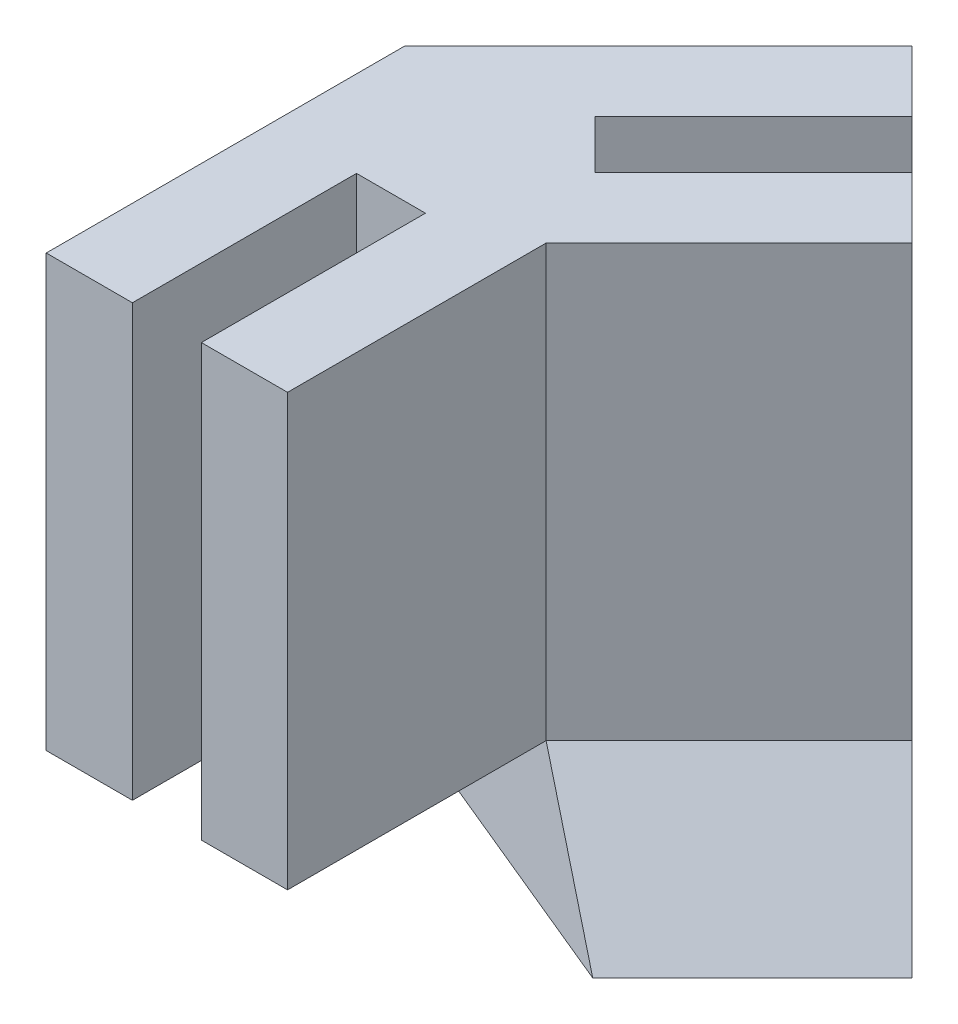
ISO-10303-21;
HEADER;
FILE_DESCRIPTION(('STEP AP214'),'2;1');
FILE_NAME('part.step','',(''),(''),'','','');
FILE_SCHEMA(('AUTOMOTIVE_DESIGN { 1 0 10303 214 1 1 1 1 }'));
ENDSEC;
DATA;
#1=APPLICATION_CONTEXT('core data for automotive mechanical design processes');
#2=APPLICATION_PROTOCOL_DEFINITION('international standard','automotive_design',2000,#1);
#3=PRODUCT_CONTEXT('',#1,'mechanical');
#4=PRODUCT('Part','Part','',(#3));
#5=PRODUCT_RELATED_PRODUCT_CATEGORY('part','',(#4));
#6=PRODUCT_DEFINITION_FORMATION('','',#4);
#7=PRODUCT_DEFINITION_CONTEXT('part definition',#1,'design');
#8=PRODUCT_DEFINITION('design','',#6,#7);
#9=PRODUCT_DEFINITION_SHAPE('','',#8);
#10=(LENGTH_UNIT() NAMED_UNIT(*) SI_UNIT(.MILLI.,.METRE.));
#11=(NAMED_UNIT(*) PLANE_ANGLE_UNIT() SI_UNIT($,.RADIAN.));
#12=(NAMED_UNIT(*) SI_UNIT($,.STERADIAN.) SOLID_ANGLE_UNIT());
#13=UNCERTAINTY_MEASURE_WITH_UNIT(LENGTH_MEASURE(1.E-05),#10,'distance_accuracy_value','');
#14=(GEOMETRIC_REPRESENTATION_CONTEXT(3) GLOBAL_UNCERTAINTY_ASSIGNED_CONTEXT((#13)) GLOBAL_UNIT_ASSIGNED_CONTEXT((#10,
#11,#12)) REPRESENTATION_CONTEXT('',''));
#15=CARTESIAN_POINT('',(0.,0.,0.));
#16=DIRECTION('',(0.,0.,1.));
#17=DIRECTION('',(1.,0.,0.));
#18=AXIS2_PLACEMENT_3D('',#15,#16,#17);
#19=CARTESIAN_POINT('',(0.,0.,0.));
#20=DIRECTION('',(0.,-1.,0.));
#21=DIRECTION('',(0.,0.,-1.));
#22=AXIS2_PLACEMENT_3D('',#19,#20,#21);
#23=PLANE('',#22);
#24=DIRECTION('',(0.,0.,1.));
#25=VECTOR('',#24,1.);
#26=CARTESIAN_POINT('',(-14.,0.,15.));
#27=LINE('',#26,#25);
#28=CARTESIAN_POINT('',(-14.,0.,-5.79898987322323));
#29=VERTEX_POINT('',#28);
#30=CARTESIAN_POINT('',(-14.,0.,15.));
#31=VERTEX_POINT('',#30);
#32=EDGE_CURVE('E136',#29,#31,#27,.T.);
#33=ORIENTED_EDGE('',*,*,#32,.F.);
#34=DIRECTION('',(0.923879532511289,0.,0.382683432365084));
#35=VECTOR('',#34,1.);
#36=CARTESIAN_POINT('',(-14.,0.,-5.79898987322323));
#37=LINE('',#36,#35);
#38=CARTESIAN_POINT('',(0.,0.,0.));
#39=VERTEX_POINT('',#38);
#40=EDGE_CURVE('E298',#29,#39,#37,.T.);
#41=ORIENTED_EDGE('',*,*,#40,.T.);
#42=DIRECTION('',(0.,0.,-1.));
#43=VECTOR('',#42,1.);
#44=CARTESIAN_POINT('',(0.,0.,0.));
#45=LINE('',#44,#43);
#46=CARTESIAN_POINT('',(0.,0.,15.));
#47=VERTEX_POINT('',#46);
#48=EDGE_CURVE('E153',#47,#39,#45,.T.);
#49=ORIENTED_EDGE('',*,*,#48,.F.);
#50=DIRECTION('',(1.,0.,0.));
#51=VECTOR('',#50,1.);
#52=CARTESIAN_POINT('',(0.,0.,15.));
#53=LINE('',#52,#51);
#54=CARTESIAN_POINT('',(-5.,0.,15.));
#55=VERTEX_POINT('',#54);
#56=EDGE_CURVE('E88',#55,#47,#53,.T.);
#57=ORIENTED_EDGE('',*,*,#56,.F.);
#58=DIRECTION('',(0.,0.,1.));
#59=VECTOR('',#58,1.);
#60=CARTESIAN_POINT('',(-5.,0.,15.));
#61=LINE('',#60,#59);
#62=CARTESIAN_POINT('',(-5.00000000000004,0.,1.99999999999999));
#63=VERTEX_POINT('',#62);
#64=EDGE_CURVE('E81',#63,#55,#61,.T.);
#65=ORIENTED_EDGE('',*,*,#64,.F.);
#66=DIRECTION('',(1.,0.,0.));
#67=VECTOR('',#66,1.);
#68=CARTESIAN_POINT('',(-5.00000000000004,0.,1.99999999999999));
#69=LINE('',#68,#67);
#70=CARTESIAN_POINT('',(-9.00000000000004,0.,1.99999999999999));
#71=VERTEX_POINT('',#70);
#72=EDGE_CURVE('E146',#71,#63,#69,.T.);
#73=ORIENTED_EDGE('',*,*,#72,.F.);
#74=DIRECTION('',(0.,0.,-1.));
#75=VECTOR('',#74,1.);
#76=CARTESIAN_POINT('',(-9.00000000000004,0.,1.99999999999999));
#77=LINE('',#76,#75);
#78=CARTESIAN_POINT('',(-9.,0.,15.));
#79=VERTEX_POINT('',#78);
#80=EDGE_CURVE('E143',#79,#71,#77,.T.);
#81=ORIENTED_EDGE('',*,*,#80,.F.);
#82=DIRECTION('',(1.,0.,0.));
#83=VECTOR('',#82,1.);
#84=CARTESIAN_POINT('',(-9.,0.,15.));
#85=LINE('',#84,#83);
#86=EDGE_CURVE('E139',#31,#79,#85,.T.);
#87=ORIENTED_EDGE('',*,*,#86,.F.);
#88=EDGE_LOOP('',(#33,#41,#49,#57,#65,#73,#81,#87));
#89=FACE_BOUND('',#88,.T.);
#90=ADVANCED_FACE('F39',(#89),#23,.T.);
#91=CARTESIAN_POINT('',(-14.,25.,15.));
#92=DIRECTION('',(1.,0.,0.));
#93=DIRECTION('',(0.,0.,-1.));
#94=AXIS2_PLACEMENT_3D('',#91,#92,#93);
#95=PLANE('',#94);
#96=ORIENTED_EDGE('',*,*,#32,.T.);
#97=DIRECTION('',(0.,-1.,0.));
#98=VECTOR('',#97,1.);
#99=CARTESIAN_POINT('',(-14.,25.,15.));
#100=LINE('',#99,#98);
#101=CARTESIAN_POINT('',(-14.,25.,15.));
#102=VERTEX_POINT('',#101);
#103=EDGE_CURVE('E49',#102,#31,#100,.T.);
#104=ORIENTED_EDGE('',*,*,#103,.F.);
#105=DIRECTION('',(0.,0.,1.));
#106=VECTOR('',#105,1.);
#107=CARTESIAN_POINT('',(-14.,25.,15.));
#108=LINE('',#107,#106);
#109=CARTESIAN_POINT('',(-14.,25.,-5.79898987322323));
#110=VERTEX_POINT('',#109);
#111=EDGE_CURVE('E96',#110,#102,#108,.T.);
#112=ORIENTED_EDGE('',*,*,#111,.F.);
#113=DIRECTION('',(0.,-1.,0.));
#114=VECTOR('',#113,1.);
#115=CARTESIAN_POINT('',(-14.,25.,-5.79898987322323));
#116=LINE('',#115,#114);
#117=EDGE_CURVE('E11',#110,#29,#116,.T.);
#118=ORIENTED_EDGE('',*,*,#117,.T.);
#119=EDGE_LOOP('',(#96,#104,#112,#118));
#120=FACE_BOUND('',#119,.T.);
#121=ADVANCED_FACE('F41',(#120),#95,.F.);
#122=CARTESIAN_POINT('',(-9.,25.,15.));
#123=DIRECTION('',(0.,0.,-1.));
#124=DIRECTION('',(-1.,0.,0.));
#125=AXIS2_PLACEMENT_3D('',#122,#123,#124);
#126=PLANE('',#125);
#127=ORIENTED_EDGE('',*,*,#86,.T.);
#128=DIRECTION('',(0.,-1.,0.));
#129=VECTOR('',#128,1.);
#130=CARTESIAN_POINT('',(-9.,25.,15.));
#131=LINE('',#130,#129);
#132=CARTESIAN_POINT('',(-9.,25.,15.));
#133=VERTEX_POINT('',#132);
#134=EDGE_CURVE('E168',#133,#79,#131,.T.);
#135=ORIENTED_EDGE('',*,*,#134,.F.);
#136=DIRECTION('',(1.,0.,0.));
#137=VECTOR('',#136,1.);
#138=CARTESIAN_POINT('',(-9.,25.,15.));
#139=LINE('',#138,#137);
#140=EDGE_CURVE('E178',#102,#133,#139,.T.);
#141=ORIENTED_EDGE('',*,*,#140,.F.);
#142=ORIENTED_EDGE('',*,*,#103,.T.);
#143=EDGE_LOOP('',(#127,#135,#141,#142));
#144=FACE_BOUND('',#143,.T.);
#145=ADVANCED_FACE('F176',(#144),#126,.F.);
#146=CARTESIAN_POINT('',(-9.00000000000004,25.,1.99999999999999));
#147=DIRECTION('',(-1.,0.,0.));
#148=DIRECTION('',(0.,0.,1.));
#149=AXIS2_PLACEMENT_3D('',#146,#147,#148);
#150=PLANE('',#149);
#151=ORIENTED_EDGE('',*,*,#80,.T.);
#152=DIRECTION('',(0.,-1.,0.));
#153=VECTOR('',#152,1.);
#154=CARTESIAN_POINT('',(-9.00000000000004,25.,1.99999999999999));
#155=LINE('',#154,#153);
#156=CARTESIAN_POINT('',(-9.00000000000004,25.,1.99999999999999));
#157=VERTEX_POINT('',#156);
#158=EDGE_CURVE('E164',#157,#71,#155,.T.);
#159=ORIENTED_EDGE('',*,*,#158,.F.);
#160=DIRECTION('',(0.,0.,-1.));
#161=VECTOR('',#160,1.);
#162=CARTESIAN_POINT('',(-9.00000000000004,25.,1.99999999999999));
#163=LINE('',#162,#161);
#164=EDGE_CURVE('E192',#133,#157,#163,.T.);
#165=ORIENTED_EDGE('',*,*,#164,.F.);
#166=ORIENTED_EDGE('',*,*,#134,.T.);
#167=EDGE_LOOP('',(#151,#159,#165,#166));
#168=FACE_BOUND('',#167,.T.);
#169=ADVANCED_FACE('F187',(#168),#150,.F.);
#170=CARTESIAN_POINT('',(-5.00000000000004,25.,1.99999999999999));
#171=DIRECTION('',(0.,0.,-1.));
#172=DIRECTION('',(-1.,0.,0.));
#173=AXIS2_PLACEMENT_3D('',#170,#171,#172);
#174=PLANE('',#173);
#175=ORIENTED_EDGE('',*,*,#72,.T.);
#176=DIRECTION('',(0.,-1.,0.));
#177=VECTOR('',#176,1.);
#178=CARTESIAN_POINT('',(-5.00000000000004,25.,1.99999999999999));
#179=LINE('',#178,#177);
#180=CARTESIAN_POINT('',(-5.00000000000004,25.,1.99999999999999));
#181=VERTEX_POINT('',#180);
#182=EDGE_CURVE('E125',#181,#63,#179,.T.);
#183=ORIENTED_EDGE('',*,*,#182,.F.);
#184=DIRECTION('',(1.,0.,0.));
#185=VECTOR('',#184,1.);
#186=CARTESIAN_POINT('',(-5.00000000000004,25.,1.99999999999999));
#187=LINE('',#186,#185);
#188=EDGE_CURVE('E118',#157,#181,#187,.T.);
#189=ORIENTED_EDGE('',*,*,#188,.F.);
#190=ORIENTED_EDGE('',*,*,#158,.T.);
#191=EDGE_LOOP('',(#175,#183,#189,#190));
#192=FACE_BOUND('',#191,.T.);
#193=ADVANCED_FACE('F190',(#192),#174,.F.);
#194=CARTESIAN_POINT('',(-5.,25.,15.));
#195=DIRECTION('',(1.,0.,0.));
#196=DIRECTION('',(0.,0.,-1.));
#197=AXIS2_PLACEMENT_3D('',#194,#195,#196);
#198=PLANE('',#197);
#199=ORIENTED_EDGE('',*,*,#64,.T.);
#200=DIRECTION('',(0.,-1.,0.));
#201=VECTOR('',#200,1.);
#202=CARTESIAN_POINT('',(-5.,25.,15.));
#203=LINE('',#202,#201);
#204=CARTESIAN_POINT('',(-5.,25.,15.));
#205=VERTEX_POINT('',#204);
#206=EDGE_CURVE('E122',#205,#55,#203,.T.);
#207=ORIENTED_EDGE('',*,*,#206,.F.);
#208=DIRECTION('',(0.,0.,1.));
#209=VECTOR('',#208,1.);
#210=CARTESIAN_POINT('',(-5.,25.,15.));
#211=LINE('',#210,#209);
#212=EDGE_CURVE('E113',#181,#205,#211,.T.);
#213=ORIENTED_EDGE('',*,*,#212,.F.);
#214=ORIENTED_EDGE('',*,*,#182,.T.);
#215=EDGE_LOOP('',(#199,#207,#213,#214));
#216=FACE_BOUND('',#215,.T.);
#217=ADVANCED_FACE('F123',(#216),#198,.F.);
#218=CARTESIAN_POINT('',(0.,25.,15.));
#219=DIRECTION('',(0.,0.,-1.));
#220=DIRECTION('',(-1.,0.,0.));
#221=AXIS2_PLACEMENT_3D('',#218,#219,#220);
#222=PLANE('',#221);
#223=ORIENTED_EDGE('',*,*,#56,.T.);
#224=DIRECTION('',(0.,-1.,0.));
#225=VECTOR('',#224,1.);
#226=CARTESIAN_POINT('',(0.,25.,15.));
#227=LINE('',#226,#225);
#228=CARTESIAN_POINT('',(0.,25.,15.));
#229=VERTEX_POINT('',#228);
#230=EDGE_CURVE('E126',#229,#47,#227,.T.);
#231=ORIENTED_EDGE('',*,*,#230,.F.);
#232=DIRECTION('',(1.,0.,0.));
#233=VECTOR('',#232,1.);
#234=CARTESIAN_POINT('',(0.,25.,15.));
#235=LINE('',#234,#233);
#236=EDGE_CURVE('E116',#205,#229,#235,.T.);
#237=ORIENTED_EDGE('',*,*,#236,.F.);
#238=ORIENTED_EDGE('',*,*,#206,.T.);
#239=EDGE_LOOP('',(#223,#231,#237,#238));
#240=FACE_BOUND('',#239,.T.);
#241=ADVANCED_FACE('F128',(#240),#222,.F.);
#242=CARTESIAN_POINT('',(0.,25.,0.));
#243=DIRECTION('',(-1.,0.,0.));
#244=DIRECTION('',(0.,0.,1.));
#245=AXIS2_PLACEMENT_3D('',#242,#243,#244);
#246=PLANE('',#245);
#247=ORIENTED_EDGE('',*,*,#48,.T.);
#248=DIRECTION('',(0.,-1.,0.));
#249=VECTOR('',#248,1.);
#250=CARTESIAN_POINT('',(0.,25.,0.));
#251=LINE('',#250,#249);
#252=CARTESIAN_POINT('',(0.,25.,0.));
#253=VERTEX_POINT('',#252);
#254=EDGE_CURVE('E132',#253,#39,#251,.T.);
#255=ORIENTED_EDGE('',*,*,#254,.F.);
#256=DIRECTION('',(0.,0.,-1.));
#257=VECTOR('',#256,1.);
#258=CARTESIAN_POINT('',(0.,25.,0.));
#259=LINE('',#258,#257);
#260=EDGE_CURVE('E57',#229,#253,#259,.T.);
#261=ORIENTED_EDGE('',*,*,#260,.F.);
#262=ORIENTED_EDGE('',*,*,#230,.T.);
#263=EDGE_LOOP('',(#247,#255,#261,#262));
#264=FACE_BOUND('',#263,.T.);
#265=ADVANCED_FACE('F328',(#264),#246,.F.);
#266=CARTESIAN_POINT('',(0.,25.,0.));
#267=DIRECTION('',(0.,-1.,0.));
#268=DIRECTION('',(0.,0.,-1.));
#269=AXIS2_PLACEMENT_3D('',#266,#267,#268);
#270=PLANE('',#269);
#271=ORIENTED_EDGE('',*,*,#260,.T.);
#272=DIRECTION('',(-0.707106781186539,0.,0.707106781186556));
#273=VECTOR('',#272,1.);
#274=CARTESIAN_POINT('',(0.,25.,0.));
#275=LINE('',#274,#273);
#276=CARTESIAN_POINT('',(10.6066017177981,25.,-10.6066017177983));
#277=VERTEX_POINT('',#276);
#278=EDGE_CURVE('E228',#277,#253,#275,.T.);
#279=ORIENTED_EDGE('',*,*,#278,.F.);
#280=DIRECTION('',(0.707106781186556,0.,0.707106781186539));
#281=VECTOR('',#280,1.);
#282=CARTESIAN_POINT('',(10.6066017177981,25.,-10.6066017177983));
#283=LINE('',#282,#281);
#284=CARTESIAN_POINT('',(7.07106781186529,25.,-14.142135623731));
#285=VERTEX_POINT('',#284);
#286=EDGE_CURVE('E265',#285,#277,#283,.T.);
#287=ORIENTED_EDGE('',*,*,#286,.F.);
#288=DIRECTION('',(0.707106781186541,0.,-0.707106781186554));
#289=VECTOR('',#288,1.);
#290=CARTESIAN_POINT('',(7.07106781186529,25.,-14.142135623731));
#291=LINE('',#290,#289);
#292=CARTESIAN_POINT('',(-2.12132034355974,25.,-4.94974746830583));
#293=VERTEX_POINT('',#292);
#294=EDGE_CURVE('E261',#293,#285,#291,.T.);
#295=ORIENTED_EDGE('',*,*,#294,.F.);
#296=DIRECTION('',(0.707106781186556,0.,0.707106781186539));
#297=VECTOR('',#296,1.);
#298=CARTESIAN_POINT('',(-2.12132034355974,25.,-4.94974746830583));
#299=LINE('',#298,#297);
#300=CARTESIAN_POINT('',(-4.94974746830597,25.,-7.77817459305198));
#301=VERTEX_POINT('',#300);
#302=EDGE_CURVE('E257',#301,#293,#299,.T.);
#303=ORIENTED_EDGE('',*,*,#302,.F.);
#304=DIRECTION('',(-0.707106781186541,0.,0.707106781186554));
#305=VECTOR('',#304,1.);
#306=CARTESIAN_POINT('',(-4.94974746830597,25.,-7.77817459305198));
#307=LINE('',#306,#305);
#308=CARTESIAN_POINT('',(4.24264068711906,25.,-16.9705627484772));
#309=VERTEX_POINT('',#308);
#310=EDGE_CURVE('E253',#309,#301,#307,.T.);
#311=ORIENTED_EDGE('',*,*,#310,.F.);
#312=DIRECTION('',(0.707106781186556,0.,0.707106781186539));
#313=VECTOR('',#312,1.);
#314=CARTESIAN_POINT('',(4.24264068711906,25.,-16.9705627484772));
#315=LINE('',#314,#313);
#316=CARTESIAN_POINT('',(0.707106781186283,25.,-20.5060966544099));
#317=VERTEX_POINT('',#316);
#318=EDGE_CURVE('E249',#317,#309,#315,.T.);
#319=ORIENTED_EDGE('',*,*,#318,.F.);
#320=DIRECTION('',(0.707106781186539,0.,-0.707106781186557));
#321=VECTOR('',#320,1.);
#322=CARTESIAN_POINT('',(0.707106781186283,25.,-20.5060966544099));
#323=LINE('',#322,#321);
#324=EDGE_CURVE('E223',#110,#317,#323,.T.);
#325=ORIENTED_EDGE('',*,*,#324,.F.);
#326=ORIENTED_EDGE('',*,*,#111,.T.);
#327=ORIENTED_EDGE('',*,*,#140,.T.);
#328=ORIENTED_EDGE('',*,*,#164,.T.);
#329=ORIENTED_EDGE('',*,*,#188,.T.);
#330=ORIENTED_EDGE('',*,*,#212,.T.);
#331=ORIENTED_EDGE('',*,*,#236,.T.);
#332=EDGE_LOOP('',(#271,#279,#287,#295,#303,#311,#319,#325,#326,#327,#328,#329,#330,#331));
#333=FACE_BOUND('',#332,.T.);
#334=ADVANCED_FACE('F114',(#333),#270,.F.);
#335=CARTESIAN_POINT('',(0.,25.,0.));
#336=DIRECTION('',(0.707106781186556,0.,0.707106781186539));
#337=DIRECTION('',(0.707106781186539,0.,-0.707106781186556));
#338=AXIS2_PLACEMENT_3D('',#335,#336,#337);
#339=PLANE('',#338);
#340=DIRECTION('',(-0.707106781186539,0.,0.707106781186556));
#341=VECTOR('',#340,1.);
#342=CARTESIAN_POINT('',(0.,0.,0.));
#343=LINE('',#342,#341);
#344=CARTESIAN_POINT('',(10.6066017177981,0.,-10.6066017177983));
#345=VERTEX_POINT('',#344);
#346=EDGE_CURVE('E241',#345,#39,#343,.T.);
#347=ORIENTED_EDGE('',*,*,#346,.F.);
#348=DIRECTION('',(0.,-1.,0.));
#349=VECTOR('',#348,1.);
#350=CARTESIAN_POINT('',(10.6066017177981,25.,-10.6066017177983));
#351=LINE('',#350,#349);
#352=EDGE_CURVE('E140',#277,#345,#351,.T.);
#353=ORIENTED_EDGE('',*,*,#352,.F.);
#354=ORIENTED_EDGE('',*,*,#278,.T.);
#355=ORIENTED_EDGE('',*,*,#254,.T.);
#356=EDGE_LOOP('',(#347,#353,#354,#355));
#357=FACE_BOUND('',#356,.T.);
#358=ADVANCED_FACE('F331',(#357),#339,.T.);
#359=CARTESIAN_POINT('',(10.6066017177981,25.,-10.6066017177983));
#360=DIRECTION('',(0.707106781186539,0.,-0.707106781186556));
#361=DIRECTION('',(-0.707106781186556,0.,-0.707106781186539));
#362=AXIS2_PLACEMENT_3D('',#359,#360,#361);
#363=PLANE('',#362);
#364=ORIENTED_EDGE('',*,*,#352,.T.);
#365=DIRECTION('',(0.332789532682576,-0.882327747423728,0.332789532682568));
#366=VECTOR('',#365,1.);
#367=CARTESIAN_POINT('',(10.6066017177981,0.,-10.6066017177983));
#368=LINE('',#367,#366);
#369=CARTESIAN_POINT('',(13.873009129989,-8.6602540378444,-7.34019430560744));
#370=VERTEX_POINT('',#369);
#371=EDGE_CURVE('E291',#345,#370,#368,.T.);
#372=ORIENTED_EDGE('',*,*,#371,.T.);
#373=DIRECTION('',(-0.707106781186556,0.,-0.707106781186539));
#374=VECTOR('',#373,1.);
#375=CARTESIAN_POINT('',(3.97351419337726,-8.6602540378444,-17.239689242219));
#376=LINE('',#375,#374);
#377=CARTESIAN_POINT('',(3.97351419337726,-8.6602540378444,-17.239689242219));
#378=VERTEX_POINT('',#377);
#379=EDGE_CURVE('E245',#370,#378,#376,.T.);
#380=ORIENTED_EDGE('',*,*,#379,.T.);
#381=DIRECTION('',(-0.332789532682576,0.882327747423728,-0.332789532682568));
#382=VECTOR('',#381,1.);
#383=CARTESIAN_POINT('',(0.707106781186287,0.,-20.5060966544099));
#384=LINE('',#383,#382);
#385=CARTESIAN_POINT('',(0.707106781186288,0.,-20.5060966544099));
#386=VERTEX_POINT('',#385);
#387=EDGE_CURVE('E283',#378,#386,#384,.T.);
#388=ORIENTED_EDGE('',*,*,#387,.T.);
#389=DIRECTION('',(0.,-1.,0.));
#390=VECTOR('',#389,1.);
#391=CARTESIAN_POINT('',(0.707106781186283,25.,-20.5060966544099));
#392=LINE('',#391,#390);
#393=EDGE_CURVE('E219',#317,#386,#392,.T.);
#394=ORIENTED_EDGE('',*,*,#393,.F.);
#395=ORIENTED_EDGE('',*,*,#318,.T.);
#396=DIRECTION('',(0.,-1.,0.));
#397=VECTOR('',#396,1.);
#398=CARTESIAN_POINT('',(4.24264068711906,25.,-16.9705627484772));
#399=LINE('',#398,#397);
#400=CARTESIAN_POINT('',(4.24264068711907,0.,-16.9705627484772));
#401=VERTEX_POINT('',#400);
#402=EDGE_CURVE('E215',#309,#401,#399,.T.);
#403=ORIENTED_EDGE('',*,*,#402,.T.);
#404=DIRECTION('',(0.707106781186556,0.,0.707106781186539));
#405=VECTOR('',#404,1.);
#406=CARTESIAN_POINT('',(0.707106781186285,0.,-20.5060966544099));
#407=LINE('',#406,#405);
#408=CARTESIAN_POINT('',(7.07106781186529,0.,-14.142135623731));
#409=VERTEX_POINT('',#408);
#410=EDGE_CURVE('E287',#401,#409,#407,.T.);
#411=ORIENTED_EDGE('',*,*,#410,.T.);
#412=DIRECTION('',(0.,-1.,0.));
#413=VECTOR('',#412,1.);
#414=CARTESIAN_POINT('',(7.07106781186529,25.,-14.142135623731));
#415=LINE('',#414,#413);
#416=EDGE_CURVE('E203',#285,#409,#415,.T.);
#417=ORIENTED_EDGE('',*,*,#416,.F.);
#418=ORIENTED_EDGE('',*,*,#286,.T.);
#419=EDGE_LOOP('',(#364,#372,#380,#388,#394,#395,#403,#411,#417,#418));
#420=FACE_BOUND('',#419,.T.);
#421=ADVANCED_FACE('F339',(#420),#363,.T.);
#422=CARTESIAN_POINT('',(7.07106781186529,25.,-14.142135623731));
#423=DIRECTION('',(-0.707106781186554,0.,-0.707106781186541));
#424=DIRECTION('',(-0.707106781186541,0.,0.707106781186554));
#425=AXIS2_PLACEMENT_3D('',#422,#423,#424);
#426=PLANE('',#425);
#427=DIRECTION('',(0.707106781186541,0.,-0.707106781186554));
#428=VECTOR('',#427,1.);
#429=CARTESIAN_POINT('',(7.07106781186529,0.,-14.142135623731));
#430=LINE('',#429,#428);
#431=CARTESIAN_POINT('',(-2.12132034355974,0.,-4.94974746830583));
#432=VERTEX_POINT('',#431);
#433=EDGE_CURVE('E237',#432,#409,#430,.T.);
#434=ORIENTED_EDGE('',*,*,#433,.F.);
#435=DIRECTION('',(0.,-1.,0.));
#436=VECTOR('',#435,1.);
#437=CARTESIAN_POINT('',(-2.12132034355974,25.,-4.94974746830583));
#438=LINE('',#437,#436);
#439=EDGE_CURVE('E207',#293,#432,#438,.T.);
#440=ORIENTED_EDGE('',*,*,#439,.F.);
#441=ORIENTED_EDGE('',*,*,#294,.T.);
#442=ORIENTED_EDGE('',*,*,#416,.T.);
#443=EDGE_LOOP('',(#434,#440,#441,#442));
#444=FACE_BOUND('',#443,.T.);
#445=ADVANCED_FACE('F346',(#444),#426,.T.);
#446=CARTESIAN_POINT('',(-2.12132034355974,25.,-4.94974746830583));
#447=DIRECTION('',(0.707106781186539,0.,-0.707106781186556));
#448=DIRECTION('',(-0.707106781186556,0.,-0.707106781186539));
#449=AXIS2_PLACEMENT_3D('',#446,#447,#448);
#450=PLANE('',#449);
#451=DIRECTION('',(0.707106781186556,0.,0.707106781186539));
#452=VECTOR('',#451,1.);
#453=CARTESIAN_POINT('',(-2.12132034355974,0.,-4.94974746830583));
#454=LINE('',#453,#452);
#455=CARTESIAN_POINT('',(-4.94974746830597,0.,-7.77817459305198));
#456=VERTEX_POINT('',#455);
#457=EDGE_CURVE('E233',#456,#432,#454,.T.);
#458=ORIENTED_EDGE('',*,*,#457,.F.);
#459=DIRECTION('',(0.,-1.,0.));
#460=VECTOR('',#459,1.);
#461=CARTESIAN_POINT('',(-4.94974746830597,25.,-7.77817459305198));
#462=LINE('',#461,#460);
#463=EDGE_CURVE('E211',#301,#456,#462,.T.);
#464=ORIENTED_EDGE('',*,*,#463,.F.);
#465=ORIENTED_EDGE('',*,*,#302,.T.);
#466=ORIENTED_EDGE('',*,*,#439,.T.);
#467=EDGE_LOOP('',(#458,#464,#465,#466));
#468=FACE_BOUND('',#467,.T.);
#469=ADVANCED_FACE('F432',(#468),#450,.T.);
#470=CARTESIAN_POINT('',(-4.94974746830597,25.,-7.77817459305198));
#471=DIRECTION('',(0.707106781186554,0.,0.707106781186541));
#472=DIRECTION('',(0.707106781186541,0.,-0.707106781186554));
#473=AXIS2_PLACEMENT_3D('',#470,#471,#472);
#474=PLANE('',#473);
#475=DIRECTION('',(-0.707106781186541,0.,0.707106781186554));
#476=VECTOR('',#475,1.);
#477=CARTESIAN_POINT('',(-4.94974746830597,0.,-7.77817459305198));
#478=LINE('',#477,#476);
#479=EDGE_CURVE('E229',#401,#456,#478,.T.);
#480=ORIENTED_EDGE('',*,*,#479,.F.);
#481=ORIENTED_EDGE('',*,*,#402,.F.);
#482=ORIENTED_EDGE('',*,*,#310,.T.);
#483=ORIENTED_EDGE('',*,*,#463,.T.);
#484=EDGE_LOOP('',(#480,#481,#482,#483));
#485=FACE_BOUND('',#484,.T.);
#486=ADVANCED_FACE('F439',(#485),#474,.T.);
#487=CARTESIAN_POINT('',(0.707106781186283,25.,-20.5060966544099));
#488=DIRECTION('',(-0.707106781186556,0.,-0.707106781186539));
#489=DIRECTION('',(-0.707106781186539,0.,0.707106781186556));
#490=AXIS2_PLACEMENT_3D('',#487,#488,#489);
#491=PLANE('',#490);
#492=DIRECTION('',(0.707106781186539,0.,-0.707106781186557));
#493=VECTOR('',#492,1.);
#494=CARTESIAN_POINT('',(0.707106781186283,0.,-20.5060966544099));
#495=LINE('',#494,#493);
#496=EDGE_CURVE('E224',#29,#386,#495,.T.);
#497=ORIENTED_EDGE('',*,*,#496,.F.);
#498=ORIENTED_EDGE('',*,*,#117,.F.);
#499=ORIENTED_EDGE('',*,*,#324,.T.);
#500=ORIENTED_EDGE('',*,*,#393,.T.);
#501=EDGE_LOOP('',(#497,#498,#499,#500));
#502=FACE_BOUND('',#501,.T.);
#503=ADVANCED_FACE('F369',(#502),#491,.T.);
#504=CARTESIAN_POINT('',(13.4910520745078,0.,-33.2900419477317));
#505=DIRECTION('',(0.,-1.,0.));
#506=DIRECTION('',(0.,0.,-1.));
#507=AXIS2_PLACEMENT_3D('',#504,#505,#506);
#508=PLANE('',#507);
#509=ORIENTED_EDGE('',*,*,#410,.F.);
#510=ORIENTED_EDGE('',*,*,#479,.T.);
#511=ORIENTED_EDGE('',*,*,#457,.T.);
#512=ORIENTED_EDGE('',*,*,#433,.T.);
#513=EDGE_LOOP('',(#509,#510,#511,#512));
#514=FACE_BOUND('',#513,.T.);
#515=ADVANCED_FACE('F454',(#514),#508,.F.);
#516=CARTESIAN_POINT('',(27.4910520745078,0.,-27.4910520745085));
#517=DIRECTION('',(-0.623899933432377,-0.470635470535498,-0.623899933432362));
#518=DIRECTION('',(-0.707106781186539,0.,0.707106781186556));
#519=AXIS2_PLACEMENT_3D('',#516,#517,#518);
#520=PLANE('',#519);
#521=ORIENTED_EDGE('',*,*,#371,.F.);
#522=ORIENTED_EDGE('',*,*,#346,.T.);
#523=DIRECTION('',(0.461939766255643,-0.86602540378444,0.191341716182541));
#524=VECTOR('',#523,1.);
#525=CARTESIAN_POINT('',(0.,0.,0.));
#526=LINE('',#525,#524);
#527=CARTESIAN_POINT('',(4.61939766255643,-8.6602540378444,1.91341716182541));
#528=VERTEX_POINT('',#527);
#529=EDGE_CURVE('E282',#39,#528,#526,.T.);
#530=ORIENTED_EDGE('',*,*,#529,.T.);
#531=DIRECTION('',(-0.707106781186539,0.,0.707106781186556));
#532=VECTOR('',#531,1.);
#533=CARTESIAN_POINT('',(32.1104497370643,-8.6602540378444,-25.5776349126831));
#534=LINE('',#533,#532);
#535=EDGE_CURVE('E278',#370,#528,#534,.T.);
#536=ORIENTED_EDGE('',*,*,#535,.F.);
#537=EDGE_LOOP('',(#521,#522,#530,#536));
#538=FACE_BOUND('',#537,.T.);
#539=ADVANCED_FACE('F461',(#538),#520,.F.);
#540=CARTESIAN_POINT('',(18.1104497370643,-8.6602540378444,-31.3766247859063));
#541=DIRECTION('',(0.,1.,0.));
#542=DIRECTION('',(0.,0.,1.));
#543=AXIS2_PLACEMENT_3D('',#540,#541,#542);
#544=PLANE('',#543);
#545=ORIENTED_EDGE('',*,*,#379,.F.);
#546=ORIENTED_EDGE('',*,*,#535,.T.);
#547=DIRECTION('',(-0.923879532511289,0.,-0.382683432365084));
#548=VECTOR('',#547,1.);
#549=CARTESIAN_POINT('',(-9.38060233744357,-8.6602540378444,-3.88557271139781));
#550=LINE('',#549,#548);
#551=CARTESIAN_POINT('',(-9.38060233744357,-8.6602540378444,-3.88557271139781));
#552=VERTEX_POINT('',#551);
#553=EDGE_CURVE('E277',#528,#552,#550,.T.);
#554=ORIENTED_EDGE('',*,*,#553,.T.);
#555=DIRECTION('',(-0.707106781186539,0.,0.707106781186556));
#556=VECTOR('',#555,1.);
#557=CARTESIAN_POINT('',(18.1104497370643,-8.6602540378444,-31.3766247859063));
#558=LINE('',#557,#556);
#559=EDGE_CURVE('E272',#378,#552,#558,.T.);
#560=ORIENTED_EDGE('',*,*,#559,.F.);
#561=EDGE_LOOP('',(#545,#546,#554,#560));
#562=FACE_BOUND('',#561,.T.);
#563=ADVANCED_FACE('F468',(#562),#544,.F.);
#564=CARTESIAN_POINT('',(13.4910520745078,0.,-33.2900419477317));
#565=DIRECTION('',(0.623899933432377,0.470635470535498,0.623899933432362));
#566=DIRECTION('',(0.707106781186539,0.,-0.707106781186556));
#567=AXIS2_PLACEMENT_3D('',#564,#565,#566);
#568=PLANE('',#567);
#569=ORIENTED_EDGE('',*,*,#387,.F.);
#570=ORIENTED_EDGE('',*,*,#559,.T.);
#571=DIRECTION('',(-0.461939766255643,0.86602540378444,-0.191341716182541));
#572=VECTOR('',#571,1.);
#573=CARTESIAN_POINT('',(-14.,0.,-5.79898987322323));
#574=LINE('',#573,#572);
#575=EDGE_CURVE('E276',#552,#29,#574,.T.);
#576=ORIENTED_EDGE('',*,*,#575,.T.);
#577=ORIENTED_EDGE('',*,*,#496,.T.);
#578=EDGE_LOOP('',(#569,#570,#576,#577));
#579=FACE_BOUND('',#578,.T.);
#580=ADVANCED_FACE('F313',(#579),#568,.F.);
#581=CARTESIAN_POINT('',(0.,0.,0.));
#582=DIRECTION('',(0.382683432365084,0.,-0.923879532511289));
#583=DIRECTION('',(-0.923879532511289,0.,-0.382683432365084));
#584=AXIS2_PLACEMENT_3D('',#581,#582,#583);
#585=PLANE('',#584);
#586=ORIENTED_EDGE('',*,*,#40,.F.);
#587=ORIENTED_EDGE('',*,*,#575,.F.);
#588=ORIENTED_EDGE('',*,*,#553,.F.);
#589=ORIENTED_EDGE('',*,*,#529,.F.);
#590=EDGE_LOOP('',(#586,#587,#588,#589));
#591=FACE_BOUND('',#590,.T.);
#592=ADVANCED_FACE('F323',(#591),#585,.F.);
#593=CLOSED_SHELL('',(#90,#121,#145,#169,#193,#217,#241,#265,#334,#358,#421,#445,#469,#486,#503,
#515,#539,#563,#580,#592));
#594=MANIFOLD_SOLID_BREP('B2',#593);
#595=ADVANCED_BREP_SHAPE_REPRESENTATION('',(#18,#594),#14);
#596=SHAPE_DEFINITION_REPRESENTATION(#9,#595);
ENDSEC;
END-ISO-10303-21;
